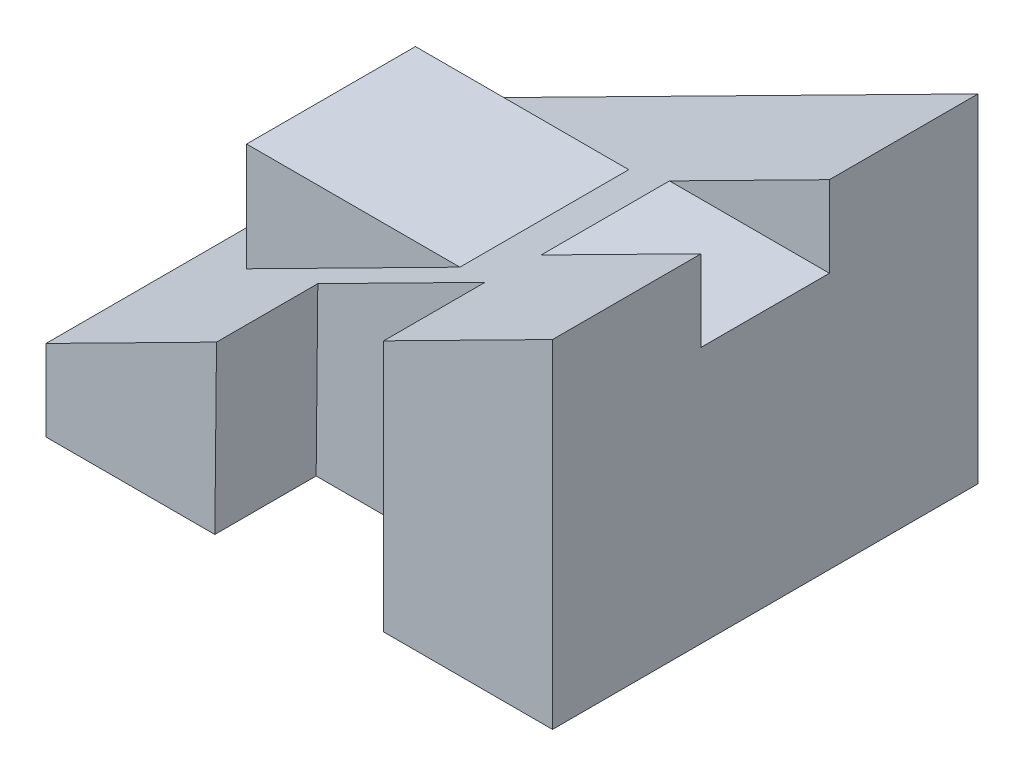
ISO-10303-21;
HEADER;
FILE_DESCRIPTION(('STEP AP214'),'2;1');
FILE_NAME('part.step','',(''),(''),'','','');
FILE_SCHEMA(('AUTOMOTIVE_DESIGN { 1 0 10303 214 1 1 1 1 }'));
ENDSEC;
DATA;
#1=APPLICATION_CONTEXT('core data for automotive mechanical design processes');
#2=APPLICATION_PROTOCOL_DEFINITION('international standard','automotive_design',2000,#1);
#3=PRODUCT_CONTEXT('',#1,'mechanical');
#4=PRODUCT('Part','Part','',(#3));
#5=PRODUCT_RELATED_PRODUCT_CATEGORY('part','',(#4));
#6=PRODUCT_DEFINITION_FORMATION('','',#4);
#7=PRODUCT_DEFINITION_CONTEXT('part definition',#1,'design');
#8=PRODUCT_DEFINITION('design','',#6,#7);
#9=PRODUCT_DEFINITION_SHAPE('','',#8);
#10=(LENGTH_UNIT() NAMED_UNIT(*) SI_UNIT(.MILLI.,.METRE.));
#11=(NAMED_UNIT(*) PLANE_ANGLE_UNIT() SI_UNIT($,.RADIAN.));
#12=(NAMED_UNIT(*) SI_UNIT($,.STERADIAN.) SOLID_ANGLE_UNIT());
#13=UNCERTAINTY_MEASURE_WITH_UNIT(LENGTH_MEASURE(1.E-05),#10,'distance_accuracy_value','');
#14=(GEOMETRIC_REPRESENTATION_CONTEXT(3) GLOBAL_UNCERTAINTY_ASSIGNED_CONTEXT((#13)) GLOBAL_UNIT_ASSIGNED_CONTEXT((#10,
#11,#12)) REPRESENTATION_CONTEXT('',''));
#15=CARTESIAN_POINT('',(0.,0.,0.));
#16=DIRECTION('',(0.,0.,1.));
#17=DIRECTION('',(1.,0.,0.));
#18=AXIS2_PLACEMENT_3D('',#15,#16,#17);
#19=CARTESIAN_POINT('',(-37.5,12.,-48.5));
#20=DIRECTION('',(0.451964793188669,-0.892035776030269,0.));
#21=DIRECTION('',(0.892035776030269,0.451964793188669,0.));
#22=AXIS2_PLACEMENT_3D('',#19,#20,#21);
#23=PLANE('',#22);
#24=DIRECTION('',(0.,0.,1.));
#25=VECTOR('',#24,1.);
#26=CARTESIAN_POINT('',(-12.2531385093441,24.7917431552656,16.5));
#27=LINE('',#26,#25);
#28=CARTESIAN_POINT('',(-12.2531385093441,24.7917431552656,16.5));
#29=VERTEX_POINT('',#28);
#30=CARTESIAN_POINT('',(-12.2531385093441,24.7917431552656,31.5));
#31=VERTEX_POINT('',#30);
#32=EDGE_CURVE('E178',#29,#31,#27,.T.);
#33=ORIENTED_EDGE('',*,*,#32,.F.);
#34=DIRECTION('',(-0.892035776030269,-0.45196479318867,0.));
#35=VECTOR('',#34,1.);
#36=CARTESIAN_POINT('',(-12.4982317159429,24.6675625972556,16.5));
#37=LINE('',#36,#35);
#38=CARTESIAN_POINT('',(12.5,37.3333333333333,16.5));
#39=VERTEX_POINT('',#38);
#40=EDGE_CURVE('E172',#39,#29,#37,.T.);
#41=ORIENTED_EDGE('',*,*,#40,.F.);
#42=DIRECTION('',(0.,0.,1.));
#43=VECTOR('',#42,1.);
#44=CARTESIAN_POINT('',(12.5,37.3333333333333,16.5));
#45=LINE('',#44,#43);
#46=CARTESIAN_POINT('',(12.5,37.3333333333333,31.5));
#47=VERTEX_POINT('',#46);
#48=EDGE_CURVE('E181',#39,#47,#45,.T.);
#49=ORIENTED_EDGE('',*,*,#48,.T.);
#50=DIRECTION('',(0.892035776030268,0.451964793188669,0.));
#51=VECTOR('',#50,1.);
#52=CARTESIAN_POINT('',(-37.5,12.,31.5));
#53=LINE('',#52,#51);
#54=CARTESIAN_POINT('',(37.5,50.,31.5));
#55=VERTEX_POINT('',#54);
#56=EDGE_CURVE('E199',#47,#55,#53,.T.);
#57=ORIENTED_EDGE('',*,*,#56,.T.);
#58=DIRECTION('',(0.,0.,-1.));
#59=VECTOR('',#58,1.);
#60=CARTESIAN_POINT('',(37.5,50.,31.5));
#61=LINE('',#60,#59);
#62=CARTESIAN_POINT('',(37.5,50.,9.50000000000001));
#63=VERTEX_POINT('',#62);
#64=EDGE_CURVE('E209',#55,#63,#61,.T.);
#65=ORIENTED_EDGE('',*,*,#64,.T.);
#66=DIRECTION('',(-0.892035776030269,-0.451964793188669,0.));
#67=VECTOR('',#66,1.);
#68=CARTESIAN_POINT('',(-37.5,12.,9.5));
#69=LINE('',#68,#67);
#70=CARTESIAN_POINT('',(13.8157894736842,38.,9.50000000000001));
#71=VERTEX_POINT('',#70);
#72=EDGE_CURVE('E11',#63,#71,#69,.T.);
#73=ORIENTED_EDGE('',*,*,#72,.T.);
#74=DIRECTION('',(0.,0.,1.));
#75=VECTOR('',#74,1.);
#76=CARTESIAN_POINT('',(13.8157894736842,38.,-48.5));
#77=LINE('',#76,#75);
#78=CARTESIAN_POINT('',(13.8157894736842,38.,-9.49999999999999));
#79=VERTEX_POINT('',#78);
#80=EDGE_CURVE('E41',#79,#71,#77,.T.);
#81=ORIENTED_EDGE('',*,*,#80,.F.);
#82=DIRECTION('',(-0.892035776030269,-0.451964793188669,0.));
#83=VECTOR('',#82,1.);
#84=CARTESIAN_POINT('',(-37.5,12.,-9.49999999999999));
#85=LINE('',#84,#83);
#86=CARTESIAN_POINT('',(37.5,50.,-9.49999999999999));
#87=VERTEX_POINT('',#86);
#88=EDGE_CURVE('E228',#87,#79,#85,.T.);
#89=ORIENTED_EDGE('',*,*,#88,.F.);
#90=CARTESIAN_POINT('',(37.5,50.,-31.5));
#91=VERTEX_POINT('',#90);
#92=EDGE_CURVE('E213',#87,#91,#61,.T.);
#93=ORIENTED_EDGE('',*,*,#92,.T.);
#94=DIRECTION('',(-0.892035776030269,-0.451964793188669,0.));
#95=VECTOR('',#94,1.);
#96=CARTESIAN_POINT('',(-22.1795869288442,19.7623426227189,-31.5));
#97=LINE('',#96,#95);
#98=CARTESIAN_POINT('',(-37.5,12.,-31.5));
#99=VERTEX_POINT('',#98);
#100=EDGE_CURVE('E206',#91,#99,#97,.T.);
#101=ORIENTED_EDGE('',*,*,#100,.T.);
#102=DIRECTION('',(0.,0.,1.));
#103=VECTOR('',#102,1.);
#104=CARTESIAN_POINT('',(-37.5,12.,-48.5));
#105=LINE('',#104,#103);
#106=CARTESIAN_POINT('',(-37.5,12.,31.5));
#107=VERTEX_POINT('',#106);
#108=EDGE_CURVE('E204',#99,#107,#105,.T.);
#109=ORIENTED_EDGE('',*,*,#108,.T.);
#110=EDGE_CURVE('E201',#107,#31,#53,.T.);
#111=ORIENTED_EDGE('',*,*,#110,.T.);
#112=EDGE_LOOP('',(#33,#41,#49,#57,#65,#73,#81,#89,#93,#101,#109,#111));
#113=FACE_BOUND('',#112,.T.);
#114=DIRECTION('',(0.892035776030269,0.451964793188669,0.));
#115=VECTOR('',#114,1.);
#116=CARTESIAN_POINT('',(4.7833766807844,33.4235775182641,12.5));
#117=LINE('',#116,#115);
#118=CARTESIAN_POINT('',(-26.7955706876368,17.423577518264,12.5));
#119=VERTEX_POINT('',#118);
#120=CARTESIAN_POINT('',(4.7833766807844,33.4235775182641,12.5));
#121=VERTEX_POINT('',#120);
#122=EDGE_CURVE('E138',#119,#121,#117,.T.);
#123=ORIENTED_EDGE('',*,*,#122,.F.);
#124=DIRECTION('',(0.,0.,-1.));
#125=VECTOR('',#124,1.);
#126=CARTESIAN_POINT('',(-26.7955706876368,17.423577518264,12.5));
#127=LINE('',#126,#125);
#128=CARTESIAN_POINT('',(-26.7955706876368,17.423577518264,-12.5));
#129=VERTEX_POINT('',#128);
#130=EDGE_CURVE('E147',#119,#129,#127,.T.);
#131=ORIENTED_EDGE('',*,*,#130,.T.);
#132=DIRECTION('',(0.892035776030269,0.451964793188669,0.));
#133=VECTOR('',#132,1.);
#134=CARTESIAN_POINT('',(4.7833766807844,33.4235775182641,-12.5));
#135=LINE('',#134,#133);
#136=CARTESIAN_POINT('',(4.78337668078439,33.4235775182641,-12.5));
#137=VERTEX_POINT('',#136);
#138=EDGE_CURVE('E161',#129,#137,#135,.T.);
#139=ORIENTED_EDGE('',*,*,#138,.T.);
#140=DIRECTION('',(0.,0.,-1.));
#141=VECTOR('',#140,1.);
#142=CARTESIAN_POINT('',(4.7833766807844,33.4235775182641,12.5));
#143=LINE('',#142,#141);
#144=EDGE_CURVE('E153',#121,#137,#143,.T.);
#145=ORIENTED_EDGE('',*,*,#144,.F.);
#146=EDGE_LOOP('',(#123,#131,#139,#145));
#147=FACE_BOUND('',#146,.T.);
#148=ADVANCED_FACE('F33',(#113,#147),#23,.F.);
#149=CARTESIAN_POINT('',(-37.5,50.,31.5));
#150=DIRECTION('',(0.,0.,-1.));
#151=DIRECTION('',(-1.,0.,0.));
#152=AXIS2_PLACEMENT_3D('',#149,#150,#151);
#153=PLANE('',#152);
#154=DIRECTION('',(0.00995691395581753,0.999950428703582,0.));
#155=VECTOR('',#154,1.);
#156=CARTESIAN_POINT('',(-12.4987607483059,0.124455254733555,31.5));
#157=LINE('',#156,#155);
#158=CARTESIAN_POINT('',(-12.5,0.,31.5));
#159=VERTEX_POINT('',#158);
#160=EDGE_CURVE('E152',#159,#31,#157,.T.);
#161=ORIENTED_EDGE('',*,*,#160,.T.);
#162=ORIENTED_EDGE('',*,*,#110,.F.);
#163=DIRECTION('',(0.,-1.,0.));
#164=VECTOR('',#163,1.);
#165=CARTESIAN_POINT('',(-37.5,50.,31.5));
#166=LINE('',#165,#164);
#167=CARTESIAN_POINT('',(-37.5,0.,31.5));
#168=VERTEX_POINT('',#167);
#169=EDGE_CURVE('E226',#107,#168,#166,.T.);
#170=ORIENTED_EDGE('',*,*,#169,.T.);
#171=DIRECTION('',(1.,0.,0.));
#172=VECTOR('',#171,1.);
#173=CARTESIAN_POINT('',(-37.5,0.,31.5));
#174=LINE('',#173,#172);
#175=EDGE_CURVE('E223',#168,#159,#174,.T.);
#176=ORIENTED_EDGE('',*,*,#175,.T.);
#177=EDGE_LOOP('',(#161,#162,#170,#176));
#178=FACE_BOUND('',#177,.T.);
#179=ADVANCED_FACE('F273',(#178),#153,.F.);
#180=CARTESIAN_POINT('',(0.,0.,0.));
#181=DIRECTION('',(0.,-1.,0.));
#182=DIRECTION('',(0.,0.,-1.));
#183=AXIS2_PLACEMENT_3D('',#180,#181,#182);
#184=PLANE('',#183);
#185=DIRECTION('',(1.,0.,0.));
#186=VECTOR('',#185,1.);
#187=CARTESIAN_POINT('',(0.,0.,16.5));
#188=LINE('',#187,#186);
#189=CARTESIAN_POINT('',(-12.5,0.,16.5));
#190=VERTEX_POINT('',#189);
#191=CARTESIAN_POINT('',(12.5,0.,16.5));
#192=VERTEX_POINT('',#191);
#193=EDGE_CURVE('E168',#190,#192,#188,.T.);
#194=ORIENTED_EDGE('',*,*,#193,.F.);
#195=DIRECTION('',(0.,0.,1.));
#196=VECTOR('',#195,1.);
#197=CARTESIAN_POINT('',(-12.5,0.,16.5));
#198=LINE('',#197,#196);
#199=EDGE_CURVE('E174',#190,#159,#198,.T.);
#200=ORIENTED_EDGE('',*,*,#199,.T.);
#201=ORIENTED_EDGE('',*,*,#175,.F.);
#202=DIRECTION('',(0.,0.,-1.));
#203=VECTOR('',#202,1.);
#204=CARTESIAN_POINT('',(-37.5,0.,31.5));
#205=LINE('',#204,#203);
#206=CARTESIAN_POINT('',(-37.5,0.,-31.5));
#207=VERTEX_POINT('',#206);
#208=EDGE_CURVE('E208',#168,#207,#205,.T.);
#209=ORIENTED_EDGE('',*,*,#208,.T.);
#210=DIRECTION('',(1.,0.,0.));
#211=VECTOR('',#210,1.);
#212=CARTESIAN_POINT('',(-37.5,0.,-31.5));
#213=LINE('',#212,#211);
#214=CARTESIAN_POINT('',(37.5,0.,-31.5));
#215=VERTEX_POINT('',#214);
#216=EDGE_CURVE('E216',#207,#215,#213,.T.);
#217=ORIENTED_EDGE('',*,*,#216,.T.);
#218=DIRECTION('',(0.,0.,-1.));
#219=VECTOR('',#218,1.);
#220=CARTESIAN_POINT('',(37.5,0.,31.5));
#221=LINE('',#220,#219);
#222=CARTESIAN_POINT('',(37.5,0.,31.5));
#223=VERTEX_POINT('',#222);
#224=EDGE_CURVE('E219',#223,#215,#221,.T.);
#225=ORIENTED_EDGE('',*,*,#224,.F.);
#226=CARTESIAN_POINT('',(12.5,0.,31.5));
#227=VERTEX_POINT('',#226);
#228=EDGE_CURVE('E222',#227,#223,#174,.T.);
#229=ORIENTED_EDGE('',*,*,#228,.F.);
#230=DIRECTION('',(0.,0.,1.));
#231=VECTOR('',#230,1.);
#232=CARTESIAN_POINT('',(12.5,0.,16.5));
#233=LINE('',#232,#231);
#234=EDGE_CURVE('E184',#192,#227,#233,.T.);
#235=ORIENTED_EDGE('',*,*,#234,.F.);
#236=EDGE_LOOP('',(#194,#200,#201,#209,#217,#225,#229,#235));
#237=FACE_BOUND('',#236,.T.);
#238=ADVANCED_FACE('F266',(#237),#184,.T.);
#239=CARTESIAN_POINT('',(-37.5,50.,31.5));
#240=DIRECTION('',(-1.,0.,0.));
#241=DIRECTION('',(0.,0.,1.));
#242=AXIS2_PLACEMENT_3D('',#239,#240,#241);
#243=PLANE('',#242);
#244=ORIENTED_EDGE('',*,*,#108,.F.);
#245=DIRECTION('',(0.,-1.,0.));
#246=VECTOR('',#245,1.);
#247=CARTESIAN_POINT('',(-37.5,50.,-31.5));
#248=LINE('',#247,#246);
#249=EDGE_CURVE('E212',#99,#207,#248,.T.);
#250=ORIENTED_EDGE('',*,*,#249,.T.);
#251=ORIENTED_EDGE('',*,*,#208,.F.);
#252=ORIENTED_EDGE('',*,*,#169,.F.);
#253=EDGE_LOOP('',(#244,#250,#251,#252));
#254=FACE_BOUND('',#253,.T.);
#255=ADVANCED_FACE('F35',(#254),#243,.T.);
#256=ORIENTED_EDGE('',*,*,#56,.F.);
#257=DIRECTION('',(0.,1.,0.));
#258=VECTOR('',#257,1.);
#259=CARTESIAN_POINT('',(12.5,0.,31.5));
#260=LINE('',#259,#258);
#261=EDGE_CURVE('E169',#227,#47,#260,.T.);
#262=ORIENTED_EDGE('',*,*,#261,.F.);
#263=ORIENTED_EDGE('',*,*,#228,.T.);
#264=DIRECTION('',(0.,-1.,0.));
#265=VECTOR('',#264,1.);
#266=CARTESIAN_POINT('',(37.5,50.,31.5));
#267=LINE('',#266,#265);
#268=EDGE_CURVE('E229',#55,#223,#267,.T.);
#269=ORIENTED_EDGE('',*,*,#268,.F.);
#270=EDGE_LOOP('',(#256,#262,#263,#269));
#271=FACE_BOUND('',#270,.T.);
#272=ADVANCED_FACE('F283',(#271),#153,.F.);
#273=CARTESIAN_POINT('',(37.5,50.,31.5));
#274=DIRECTION('',(-1.,0.,0.));
#275=DIRECTION('',(0.,0.,1.));
#276=AXIS2_PLACEMENT_3D('',#273,#274,#275);
#277=PLANE('',#276);
#278=DIRECTION('',(0.,0.,1.));
#279=VECTOR('',#278,1.);
#280=CARTESIAN_POINT('',(37.5,38.,0.));
#281=LINE('',#280,#279);
#282=CARTESIAN_POINT('',(37.5,38.,-9.49999999999999));
#283=VERTEX_POINT('',#282);
#284=CARTESIAN_POINT('',(37.5,38.,9.50000000000001));
#285=VERTEX_POINT('',#284);
#286=EDGE_CURVE('E180',#283,#285,#281,.T.);
#287=ORIENTED_EDGE('',*,*,#286,.T.);
#288=DIRECTION('',(0.,-1.,0.));
#289=VECTOR('',#288,1.);
#290=CARTESIAN_POINT('',(37.5,0.,9.49999999999999));
#291=LINE('',#290,#289);
#292=EDGE_CURVE('E193',#63,#285,#291,.T.);
#293=ORIENTED_EDGE('',*,*,#292,.F.);
#294=ORIENTED_EDGE('',*,*,#64,.F.);
#295=ORIENTED_EDGE('',*,*,#268,.T.);
#296=ORIENTED_EDGE('',*,*,#224,.T.);
#297=DIRECTION('',(0.,-1.,0.));
#298=VECTOR('',#297,1.);
#299=CARTESIAN_POINT('',(37.5,50.,-31.5));
#300=LINE('',#299,#298);
#301=EDGE_CURVE('E232',#91,#215,#300,.T.);
#302=ORIENTED_EDGE('',*,*,#301,.F.);
#303=ORIENTED_EDGE('',*,*,#92,.F.);
#304=DIRECTION('',(0.,-1.,0.));
#305=VECTOR('',#304,1.);
#306=CARTESIAN_POINT('',(37.5,0.,-9.49999999999999));
#307=LINE('',#306,#305);
#308=EDGE_CURVE('E190',#87,#283,#307,.T.);
#309=ORIENTED_EDGE('',*,*,#308,.T.);
#310=EDGE_LOOP('',(#287,#293,#294,#295,#296,#302,#303,#309));
#311=FACE_BOUND('',#310,.T.);
#312=ADVANCED_FACE('F251',(#311),#277,.F.);
#313=CARTESIAN_POINT('',(-37.5,50.,-31.5));
#314=DIRECTION('',(0.,0.,-1.));
#315=DIRECTION('',(-1.,0.,0.));
#316=AXIS2_PLACEMENT_3D('',#313,#314,#315);
#317=PLANE('',#316);
#318=ORIENTED_EDGE('',*,*,#100,.F.);
#319=ORIENTED_EDGE('',*,*,#301,.T.);
#320=ORIENTED_EDGE('',*,*,#216,.F.);
#321=ORIENTED_EDGE('',*,*,#249,.F.);
#322=EDGE_LOOP('',(#318,#319,#320,#321));
#323=FACE_BOUND('',#322,.T.);
#324=ADVANCED_FACE('F261',(#323),#317,.T.);
#325=CARTESIAN_POINT('',(-42.5,38.,0.));
#326=DIRECTION('',(0.,1.,0.));
#327=DIRECTION('',(0.,0.,1.));
#328=AXIS2_PLACEMENT_3D('',#325,#326,#327);
#329=PLANE('',#328);
#330=ORIENTED_EDGE('',*,*,#80,.T.);
#331=DIRECTION('',(1.,0.,0.));
#332=VECTOR('',#331,1.);
#333=CARTESIAN_POINT('',(-42.5,38.,9.50000000000001));
#334=LINE('',#333,#332);
#335=EDGE_CURVE('E197',#71,#285,#334,.T.);
#336=ORIENTED_EDGE('',*,*,#335,.T.);
#337=ORIENTED_EDGE('',*,*,#286,.F.);
#338=DIRECTION('',(1.,0.,0.));
#339=VECTOR('',#338,1.);
#340=CARTESIAN_POINT('',(-42.5,38.,-9.49999999999999));
#341=LINE('',#340,#339);
#342=EDGE_CURVE('E196',#79,#283,#341,.T.);
#343=ORIENTED_EDGE('',*,*,#342,.F.);
#344=EDGE_LOOP('',(#330,#336,#337,#343));
#345=FACE_BOUND('',#344,.T.);
#346=ADVANCED_FACE('F239',(#345),#329,.T.);
#347=CARTESIAN_POINT('',(-42.5,0.,9.49999999999999));
#348=DIRECTION('',(0.,0.,1.));
#349=DIRECTION('',(0.,-1.,0.));
#350=AXIS2_PLACEMENT_3D('',#347,#348,#349);
#351=PLANE('',#350);
#352=ORIENTED_EDGE('',*,*,#292,.T.);
#353=ORIENTED_EDGE('',*,*,#335,.F.);
#354=ORIENTED_EDGE('',*,*,#72,.F.);
#355=EDGE_LOOP('',(#352,#353,#354));
#356=FACE_BOUND('',#355,.T.);
#357=ADVANCED_FACE('F244',(#356),#351,.F.);
#358=CARTESIAN_POINT('',(-42.5,0.,-9.49999999999999));
#359=DIRECTION('',(0.,0.,1.));
#360=DIRECTION('',(1.,0.,0.));
#361=AXIS2_PLACEMENT_3D('',#358,#359,#360);
#362=PLANE('',#361);
#363=ORIENTED_EDGE('',*,*,#88,.T.);
#364=ORIENTED_EDGE('',*,*,#342,.T.);
#365=ORIENTED_EDGE('',*,*,#308,.F.);
#366=EDGE_LOOP('',(#363,#364,#365));
#367=FACE_BOUND('',#366,.T.);
#368=ADVANCED_FACE('F256',(#367),#362,.T.);
#369=CARTESIAN_POINT('',(-12.4987607483059,0.124455254733555,16.5));
#370=DIRECTION('',(0.999950428703581,-0.00995691395581753,0.));
#371=DIRECTION('',(0.00995691395581753,0.999950428703582,0.));
#372=AXIS2_PLACEMENT_3D('',#369,#370,#371);
#373=PLANE('',#372);
#374=ORIENTED_EDGE('',*,*,#160,.F.);
#375=ORIENTED_EDGE('',*,*,#199,.F.);
#376=DIRECTION('',(0.00995691395581753,0.999950428703582,0.));
#377=VECTOR('',#376,1.);
#378=CARTESIAN_POINT('',(-12.4987607483059,0.124455254733555,16.5));
#379=LINE('',#378,#377);
#380=EDGE_CURVE('E166',#190,#29,#379,.T.);
#381=ORIENTED_EDGE('',*,*,#380,.T.);
#382=ORIENTED_EDGE('',*,*,#32,.T.);
#383=EDGE_LOOP('',(#374,#375,#381,#382));
#384=FACE_BOUND('',#383,.T.);
#385=ADVANCED_FACE('F275',(#384),#373,.T.);
#386=CARTESIAN_POINT('',(12.5,0.,16.5));
#387=DIRECTION('',(1.,0.,0.));
#388=DIRECTION('',(0.,0.,-1.));
#389=AXIS2_PLACEMENT_3D('',#386,#387,#388);
#390=PLANE('',#389);
#391=ORIENTED_EDGE('',*,*,#261,.T.);
#392=ORIENTED_EDGE('',*,*,#48,.F.);
#393=DIRECTION('',(0.,1.,0.));
#394=VECTOR('',#393,1.);
#395=CARTESIAN_POINT('',(12.5,0.,16.5));
#396=LINE('',#395,#394);
#397=EDGE_CURVE('E56',#192,#39,#396,.T.);
#398=ORIENTED_EDGE('',*,*,#397,.F.);
#399=ORIENTED_EDGE('',*,*,#234,.T.);
#400=EDGE_LOOP('',(#391,#392,#398,#399));
#401=FACE_BOUND('',#400,.T.);
#402=ADVANCED_FACE('F284',(#401),#390,.F.);
#403=CARTESIAN_POINT('',(0.,0.,16.5));
#404=DIRECTION('',(0.,0.,1.));
#405=DIRECTION('',(1.,0.,0.));
#406=AXIS2_PLACEMENT_3D('',#403,#404,#405);
#407=PLANE('',#406);
#408=ORIENTED_EDGE('',*,*,#380,.F.);
#409=ORIENTED_EDGE('',*,*,#193,.T.);
#410=ORIENTED_EDGE('',*,*,#397,.T.);
#411=ORIENTED_EDGE('',*,*,#40,.T.);
#412=EDGE_LOOP('',(#408,#409,#410,#411));
#413=FACE_BOUND('',#412,.T.);
#414=ADVANCED_FACE('F278',(#413),#407,.T.);
#415=CARTESIAN_POINT('',(-26.7955706876368,17.423577518264,12.5));
#416=DIRECTION('',(1.,0.,0.));
#417=DIRECTION('',(0.,0.,-1.));
#418=AXIS2_PLACEMENT_3D('',#415,#416,#417);
#419=PLANE('',#418);
#420=DIRECTION('',(0.,-1.,0.));
#421=VECTOR('',#420,1.);
#422=CARTESIAN_POINT('',(-26.7955706876368,17.423577518264,-12.5));
#423=LINE('',#422,#421);
#424=CARTESIAN_POINT('',(-26.7955706876368,33.423577518264,-12.5));
#425=VERTEX_POINT('',#424);
#426=EDGE_CURVE('E149',#425,#129,#423,.T.);
#427=ORIENTED_EDGE('',*,*,#426,.T.);
#428=ORIENTED_EDGE('',*,*,#130,.F.);
#429=DIRECTION('',(0.,-1.,0.));
#430=VECTOR('',#429,1.);
#431=CARTESIAN_POINT('',(-26.7955706876368,17.423577518264,12.5));
#432=LINE('',#431,#430);
#433=CARTESIAN_POINT('',(-26.7955706876368,33.423577518264,12.5));
#434=VERTEX_POINT('',#433);
#435=EDGE_CURVE('E134',#434,#119,#432,.T.);
#436=ORIENTED_EDGE('',*,*,#435,.F.);
#437=DIRECTION('',(0.,0.,-1.));
#438=VECTOR('',#437,1.);
#439=CARTESIAN_POINT('',(-26.7955706876368,33.423577518264,12.5));
#440=LINE('',#439,#438);
#441=EDGE_CURVE('E157',#434,#425,#440,.T.);
#442=ORIENTED_EDGE('',*,*,#441,.T.);
#443=EDGE_LOOP('',(#427,#428,#436,#442));
#444=FACE_BOUND('',#443,.T.);
#445=ADVANCED_FACE('F148',(#444),#419,.F.);
#446=CARTESIAN_POINT('',(-26.7955706876368,33.423577518264,12.5));
#447=DIRECTION('',(0.,-1.,0.));
#448=DIRECTION('',(1.,0.,0.));
#449=AXIS2_PLACEMENT_3D('',#446,#447,#448);
#450=PLANE('',#449);
#451=DIRECTION('',(-1.,0.,0.));
#452=VECTOR('',#451,1.);
#453=CARTESIAN_POINT('',(-26.7955706876368,33.423577518264,-12.5));
#454=LINE('',#453,#452);
#455=EDGE_CURVE('E48',#137,#425,#454,.T.);
#456=ORIENTED_EDGE('',*,*,#455,.T.);
#457=ORIENTED_EDGE('',*,*,#441,.F.);
#458=DIRECTION('',(-1.,0.,0.));
#459=VECTOR('',#458,1.);
#460=CARTESIAN_POINT('',(-26.7955706876368,33.423577518264,12.5));
#461=LINE('',#460,#459);
#462=EDGE_CURVE('E140',#121,#434,#461,.T.);
#463=ORIENTED_EDGE('',*,*,#462,.F.);
#464=ORIENTED_EDGE('',*,*,#144,.T.);
#465=EDGE_LOOP('',(#456,#457,#463,#464));
#466=FACE_BOUND('',#465,.T.);
#467=ADVANCED_FACE('F352',(#466),#450,.F.);
#468=CARTESIAN_POINT('',(0.,0.,12.5));
#469=DIRECTION('',(0.,0.,-1.));
#470=DIRECTION('',(-1.,0.,0.));
#471=AXIS2_PLACEMENT_3D('',#468,#469,#470);
#472=PLANE('',#471);
#473=ORIENTED_EDGE('',*,*,#435,.T.);
#474=ORIENTED_EDGE('',*,*,#122,.T.);
#475=ORIENTED_EDGE('',*,*,#462,.T.);
#476=EDGE_LOOP('',(#473,#474,#475));
#477=FACE_BOUND('',#476,.T.);
#478=ADVANCED_FACE('F136',(#477),#472,.F.);
#479=CARTESIAN_POINT('',(0.,0.,-12.5));
#480=DIRECTION('',(0.,0.,-1.));
#481=DIRECTION('',(-1.,0.,0.));
#482=AXIS2_PLACEMENT_3D('',#479,#480,#481);
#483=PLANE('',#482);
#484=ORIENTED_EDGE('',*,*,#426,.F.);
#485=ORIENTED_EDGE('',*,*,#455,.F.);
#486=ORIENTED_EDGE('',*,*,#138,.F.);
#487=EDGE_LOOP('',(#484,#485,#486));
#488=FACE_BOUND('',#487,.T.);
#489=ADVANCED_FACE('F370',(#488),#483,.T.);
#490=CLOSED_SHELL('',(#148,#179,#238,#255,#272,#312,#324,#346,#357,#368,#385,#402,#414,#445,
#467,#478,#489));
#491=MANIFOLD_SOLID_BREP('B2',#490);
#492=ADVANCED_BREP_SHAPE_REPRESENTATION('',(#18,#491),#14);
#493=SHAPE_DEFINITION_REPRESENTATION(#9,#492);
ENDSEC;
END-ISO-10303-21;
